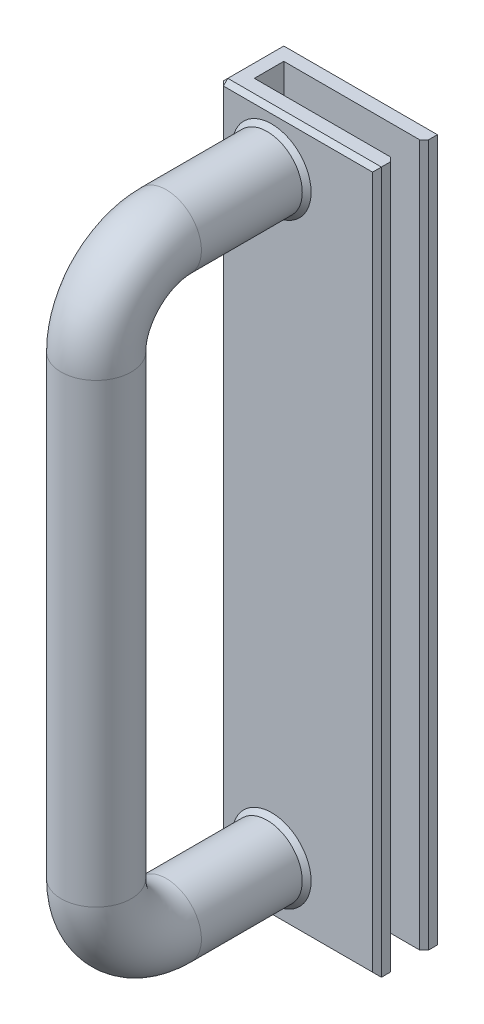
ISO-10303-21;
HEADER;
FILE_DESCRIPTION(('STEP AP214'),'2;1');
FILE_NAME('part.step','',(''),(''),'','','');
FILE_SCHEMA(('AUTOMOTIVE_DESIGN { 1 0 10303 214 1 1 1 1 }'));
ENDSEC;
DATA;
#1=APPLICATION_CONTEXT('core data for automotive mechanical design processes');
#2=APPLICATION_PROTOCOL_DEFINITION('international standard','automotive_design',2000,#1);
#3=PRODUCT_CONTEXT('',#1,'mechanical');
#4=PRODUCT('Part','Part','',(#3));
#5=PRODUCT_RELATED_PRODUCT_CATEGORY('part','',(#4));
#6=PRODUCT_DEFINITION_FORMATION('','',#4);
#7=PRODUCT_DEFINITION_CONTEXT('part definition',#1,'design');
#8=PRODUCT_DEFINITION('design','',#6,#7);
#9=PRODUCT_DEFINITION_SHAPE('','',#8);
#10=(LENGTH_UNIT() NAMED_UNIT(*) SI_UNIT(.MILLI.,.METRE.));
#11=(NAMED_UNIT(*) PLANE_ANGLE_UNIT() SI_UNIT($,.RADIAN.));
#12=(NAMED_UNIT(*) SI_UNIT($,.STERADIAN.) SOLID_ANGLE_UNIT());
#13=UNCERTAINTY_MEASURE_WITH_UNIT(LENGTH_MEASURE(1.E-05),#10,'distance_accuracy_value','');
#14=(GEOMETRIC_REPRESENTATION_CONTEXT(3) GLOBAL_UNCERTAINTY_ASSIGNED_CONTEXT((#13)) GLOBAL_UNIT_ASSIGNED_CONTEXT((#10,
#11,#12)) REPRESENTATION_CONTEXT('',''));
#15=CARTESIAN_POINT('',(0.,0.,0.));
#16=DIRECTION('',(0.,0.,1.));
#17=DIRECTION('',(1.,0.,0.));
#18=AXIS2_PLACEMENT_3D('',#15,#16,#17);
#19=CARTESIAN_POINT('',(12.7,127.,5.867));
#20=DIRECTION('',(0.,0.,-1.));
#21=DIRECTION('',(1.,0.,0.));
#22=AXIS2_PLACEMENT_3D('',#19,#20,#21);
#23=PLANE('',#22);
#24=DIRECTION('',(0.,-1.,0.));
#25=VECTOR('',#24,1.);
#26=CARTESIAN_POINT('',(11.9,127.,5.867));
#27=LINE('',#26,#25);
#28=CARTESIAN_POINT('',(11.9,126.2,5.867));
#29=VERTEX_POINT('',#28);
#30=CARTESIAN_POINT('',(11.9,0.799999999999967,5.867));
#31=VERTEX_POINT('',#30);
#32=EDGE_CURVE('E279',#29,#31,#27,.T.);
#33=ORIENTED_EDGE('',*,*,#32,.F.);
#34=DIRECTION('',(1.,0.,0.));
#35=VECTOR('',#34,1.);
#36=CARTESIAN_POINT('',(12.7,126.2,5.867));
#37=LINE('',#36,#35);
#38=CARTESIAN_POINT('',(-15.1,126.2,5.867));
#39=VERTEX_POINT('',#38);
#40=EDGE_CURVE('E282',#39,#29,#37,.T.);
#41=ORIENTED_EDGE('',*,*,#40,.F.);
#42=DIRECTION('',(0.,1.,0.));
#43=VECTOR('',#42,1.);
#44=CARTESIAN_POINT('',(-15.1,127.,5.867));
#45=LINE('',#44,#43);
#46=CARTESIAN_POINT('',(-15.1,0.799999999999967,5.867));
#47=VERTEX_POINT('',#46);
#48=EDGE_CURVE('E285',#47,#39,#45,.T.);
#49=ORIENTED_EDGE('',*,*,#48,.F.);
#50=DIRECTION('',(-1.,0.,0.));
#51=VECTOR('',#50,1.);
#52=CARTESIAN_POINT('',(12.7,0.799999999999967,5.867));
#53=LINE('',#52,#51);
#54=EDGE_CURVE('E287',#31,#47,#53,.T.);
#55=ORIENTED_EDGE('',*,*,#54,.F.);
#56=EDGE_LOOP('',(#33,#41,#49,#55));
#57=FACE_BOUND('',#56,.T.);
#58=CARTESIAN_POINT('',(-6.375,9.52500000000001,5.867));
#59=DIRECTION('',(0.,0.,1.));
#60=DIRECTION('',(1.,0.,0.));
#61=AXIS2_PLACEMENT_3D('',#58,#59,#60);
#62=CIRCLE('',#61,7.15);
#63=CARTESIAN_POINT('',(0.775000000000001,9.52500000000001,5.867));
#64=VERTEX_POINT('',#63);
#65=EDGE_CURVE('E276',#64,#64,#62,.T.);
#66=ORIENTED_EDGE('',*,*,#65,.F.);
#67=EDGE_LOOP('',(#66));
#68=FACE_BOUND('',#67,.T.);
#69=CARTESIAN_POINT('',(-6.375,117.475,5.867));
#70=DIRECTION('',(0.,0.,1.));
#71=DIRECTION('',(1.,0.,0.));
#72=AXIS2_PLACEMENT_3D('',#69,#70,#71);
#73=CIRCLE('',#72,7.15);
#74=CARTESIAN_POINT('',(0.775000000000001,117.475,5.867));
#75=VERTEX_POINT('',#74);
#76=EDGE_CURVE('E273',#75,#75,#73,.T.);
#77=ORIENTED_EDGE('',*,*,#76,.F.);
#78=EDGE_LOOP('',(#77));
#79=FACE_BOUND('',#78,.T.);
#80=ADVANCED_FACE('F40',(#57,#68,#79),#23,.F.);
#81=CARTESIAN_POINT('',(12.7,127.,-5.867));
#82=DIRECTION('',(-1.,0.,0.));
#83=DIRECTION('',(0.,0.,-1.));
#84=AXIS2_PLACEMENT_3D('',#81,#82,#83);
#85=PLANE('',#84);
#86=DIRECTION('',(0.,0.,1.));
#87=VECTOR('',#86,1.);
#88=CARTESIAN_POINT('',(12.7,0.,-5.867));
#89=LINE('',#88,#87);
#90=CARTESIAN_POINT('',(12.7,0.,-5.06700000000003));
#91=VERTEX_POINT('',#90);
#92=CARTESIAN_POINT('',(12.7,0.,-3.467));
#93=VERTEX_POINT('',#92);
#94=EDGE_CURVE('E195',#91,#93,#89,.T.);
#95=ORIENTED_EDGE('',*,*,#94,.F.);
#96=DIRECTION('',(0.,-1.,0.));
#97=VECTOR('',#96,1.);
#98=CARTESIAN_POINT('',(12.7,127.,-5.06700000000003));
#99=LINE('',#98,#97);
#100=CARTESIAN_POINT('',(12.7,127.,-5.06700000000003));
#101=VERTEX_POINT('',#100);
#102=EDGE_CURVE('E222',#101,#91,#99,.T.);
#103=ORIENTED_EDGE('',*,*,#102,.F.);
#104=DIRECTION('',(0.,0.,1.));
#105=VECTOR('',#104,1.);
#106=CARTESIAN_POINT('',(12.7,127.,-5.867));
#107=LINE('',#106,#105);
#108=CARTESIAN_POINT('',(12.7,127.,-3.467));
#109=VERTEX_POINT('',#108);
#110=EDGE_CURVE('E184',#101,#109,#107,.T.);
#111=ORIENTED_EDGE('',*,*,#110,.T.);
#112=DIRECTION('',(0.,1.,0.));
#113=VECTOR('',#112,1.);
#114=CARTESIAN_POINT('',(12.7,127.,-3.467));
#115=LINE('',#114,#113);
#116=EDGE_CURVE('E225',#93,#109,#115,.T.);
#117=ORIENTED_EDGE('',*,*,#116,.F.);
#118=EDGE_LOOP('',(#95,#103,#111,#117));
#119=FACE_BOUND('',#118,.T.);
#120=ADVANCED_FACE('F358',(#119),#85,.F.);
#121=CARTESIAN_POINT('',(12.7,127.,-2.667));
#122=DIRECTION('',(0.,0.,-1.));
#123=DIRECTION('',(1.,0.,0.));
#124=AXIS2_PLACEMENT_3D('',#121,#122,#123);
#125=PLANE('',#124);
#126=DIRECTION('',(-1.,0.,0.));
#127=VECTOR('',#126,1.);
#128=CARTESIAN_POINT('',(12.7,127.,-2.667));
#129=LINE('',#128,#127);
#130=CARTESIAN_POINT('',(11.9,127.,-2.667));
#131=VERTEX_POINT('',#130);
#132=CARTESIAN_POINT('',(-12.7,127.,-2.667));
#133=VERTEX_POINT('',#132);
#134=EDGE_CURVE('E163',#131,#133,#129,.T.);
#135=ORIENTED_EDGE('',*,*,#134,.T.);
#136=DIRECTION('',(0.,-1.,0.));
#137=VECTOR('',#136,1.);
#138=CARTESIAN_POINT('',(-12.7,127.,-2.667));
#139=LINE('',#138,#137);
#140=CARTESIAN_POINT('',(-12.7,0.,-2.667));
#141=VERTEX_POINT('',#140);
#142=EDGE_CURVE('E171',#133,#141,#139,.T.);
#143=ORIENTED_EDGE('',*,*,#142,.T.);
#144=DIRECTION('',(-1.,0.,0.));
#145=VECTOR('',#144,1.);
#146=CARTESIAN_POINT('',(12.7,0.,-2.667));
#147=LINE('',#146,#145);
#148=CARTESIAN_POINT('',(11.9,0.,-2.667));
#149=VERTEX_POINT('',#148);
#150=EDGE_CURVE('E198',#149,#141,#147,.T.);
#151=ORIENTED_EDGE('',*,*,#150,.F.);
#152=DIRECTION('',(0.,-1.,0.));
#153=VECTOR('',#152,1.);
#154=CARTESIAN_POINT('',(11.9,127.,-2.667));
#155=LINE('',#154,#153);
#156=EDGE_CURVE('E178',#131,#149,#155,.T.);
#157=ORIENTED_EDGE('',*,*,#156,.F.);
#158=EDGE_LOOP('',(#135,#143,#151,#157));
#159=FACE_BOUND('',#158,.T.);
#160=ADVANCED_FACE('F182',(#159),#125,.F.);
#161=CARTESIAN_POINT('',(-12.7,127.,-2.667));
#162=DIRECTION('',(-1.,0.,0.));
#163=DIRECTION('',(0.,0.,-1.));
#164=AXIS2_PLACEMENT_3D('',#161,#162,#163);
#165=PLANE('',#164);
#166=DIRECTION('',(0.,0.,1.));
#167=VECTOR('',#166,1.);
#168=CARTESIAN_POINT('',(-12.7,0.,-2.667));
#169=LINE('',#168,#167);
#170=CARTESIAN_POINT('',(-12.7,0.,2.667));
#171=VERTEX_POINT('',#170);
#172=EDGE_CURVE('E174',#141,#171,#169,.T.);
#173=ORIENTED_EDGE('',*,*,#172,.F.);
#174=ORIENTED_EDGE('',*,*,#142,.F.);
#175=DIRECTION('',(0.,0.,1.));
#176=VECTOR('',#175,1.);
#177=CARTESIAN_POINT('',(-12.7,127.,-2.667));
#178=LINE('',#177,#176);
#179=CARTESIAN_POINT('',(-12.7,127.,2.667));
#180=VERTEX_POINT('',#179);
#181=EDGE_CURVE('E158',#133,#180,#178,.T.);
#182=ORIENTED_EDGE('',*,*,#181,.T.);
#183=DIRECTION('',(0.,-1.,0.));
#184=VECTOR('',#183,1.);
#185=CARTESIAN_POINT('',(-12.7,127.,2.667));
#186=LINE('',#185,#184);
#187=EDGE_CURVE('E179',#180,#171,#186,.T.);
#188=ORIENTED_EDGE('',*,*,#187,.T.);
#189=EDGE_LOOP('',(#173,#174,#182,#188));
#190=FACE_BOUND('',#189,.T.);
#191=ADVANCED_FACE('F172',(#190),#165,.F.);
#192=CARTESIAN_POINT('',(-12.7,127.,2.667));
#193=DIRECTION('',(0.,0.,1.));
#194=DIRECTION('',(-1.,0.,0.));
#195=AXIS2_PLACEMENT_3D('',#192,#193,#194);
#196=PLANE('',#195);
#197=DIRECTION('',(1.,0.,0.));
#198=VECTOR('',#197,1.);
#199=CARTESIAN_POINT('',(-12.7,0.,2.667));
#200=LINE('',#199,#198);
#201=CARTESIAN_POINT('',(11.9,0.,2.667));
#202=VERTEX_POINT('',#201);
#203=EDGE_CURVE('E202',#171,#202,#200,.T.);
#204=ORIENTED_EDGE('',*,*,#203,.F.);
#205=ORIENTED_EDGE('',*,*,#187,.F.);
#206=DIRECTION('',(1.,0.,0.));
#207=VECTOR('',#206,1.);
#208=CARTESIAN_POINT('',(-12.7,127.,2.667));
#209=LINE('',#208,#207);
#210=CARTESIAN_POINT('',(11.9,127.,2.667));
#211=VERTEX_POINT('',#210);
#212=EDGE_CURVE('E165',#180,#211,#209,.T.);
#213=ORIENTED_EDGE('',*,*,#212,.T.);
#214=DIRECTION('',(0.,1.,0.));
#215=VECTOR('',#214,1.);
#216=CARTESIAN_POINT('',(11.9,127.,2.667));
#217=LINE('',#216,#215);
#218=EDGE_CURVE('E247',#202,#211,#217,.T.);
#219=ORIENTED_EDGE('',*,*,#218,.F.);
#220=EDGE_LOOP('',(#204,#205,#213,#219));
#221=FACE_BOUND('',#220,.T.);
#222=ADVANCED_FACE('F375',(#221),#196,.F.);
#223=CARTESIAN_POINT('',(12.7,127.,2.667));
#224=DIRECTION('',(-1.,0.,0.));
#225=DIRECTION('',(0.,0.,-1.));
#226=AXIS2_PLACEMENT_3D('',#223,#224,#225);
#227=PLANE('',#226);
#228=DIRECTION('',(0.,0.,1.));
#229=VECTOR('',#228,1.);
#230=CARTESIAN_POINT('',(12.7,127.,2.667));
#231=LINE('',#230,#229);
#232=CARTESIAN_POINT('',(12.7,127.,3.46700000000001));
#233=VERTEX_POINT('',#232);
#234=CARTESIAN_POINT('',(12.7,127.,5.06700000000001));
#235=VERTEX_POINT('',#234);
#236=EDGE_CURVE('E192',#233,#235,#231,.T.);
#237=ORIENTED_EDGE('',*,*,#236,.T.);
#238=DIRECTION('',(0.,1.,0.));
#239=VECTOR('',#238,1.);
#240=CARTESIAN_POINT('',(12.7,127.,5.06700000000001));
#241=LINE('',#240,#239);
#242=CARTESIAN_POINT('',(12.7,0.,5.06700000000001));
#243=VERTEX_POINT('',#242);
#244=EDGE_CURVE('E241',#243,#235,#241,.T.);
#245=ORIENTED_EDGE('',*,*,#244,.F.);
#246=DIRECTION('',(0.,0.,1.));
#247=VECTOR('',#246,1.);
#248=CARTESIAN_POINT('',(12.7,0.,2.667));
#249=LINE('',#248,#247);
#250=CARTESIAN_POINT('',(12.7,0.,3.46700000000001));
#251=VERTEX_POINT('',#250);
#252=EDGE_CURVE('E187',#251,#243,#249,.T.);
#253=ORIENTED_EDGE('',*,*,#252,.F.);
#254=DIRECTION('',(0.,-1.,0.));
#255=VECTOR('',#254,1.);
#256=CARTESIAN_POINT('',(12.7,127.,3.46700000000001));
#257=LINE('',#256,#255);
#258=EDGE_CURVE('E244',#233,#251,#257,.T.);
#259=ORIENTED_EDGE('',*,*,#258,.F.);
#260=EDGE_LOOP('',(#237,#245,#253,#259));
#261=FACE_BOUND('',#260,.T.);
#262=ADVANCED_FACE('F372',(#261),#227,.F.);
#263=CARTESIAN_POINT('',(-15.9,127.,5.867));
#264=DIRECTION('',(1.,0.,0.));
#265=DIRECTION('',(0.,0.,1.));
#266=AXIS2_PLACEMENT_3D('',#263,#264,#265);
#267=PLANE('',#266);
#268=DIRECTION('',(0.,-1.,0.));
#269=VECTOR('',#268,1.);
#270=CARTESIAN_POINT('',(-15.9,127.,5.06700000000001));
#271=LINE('',#270,#269);
#272=CARTESIAN_POINT('',(-15.9,126.2,5.06700000000001));
#273=VERTEX_POINT('',#272);
#274=CARTESIAN_POINT('',(-15.9,0.799999999999967,5.06700000000001));
#275=VERTEX_POINT('',#274);
#276=EDGE_CURVE('E265',#273,#275,#271,.T.);
#277=ORIENTED_EDGE('',*,*,#276,.F.);
#278=DIRECTION('',(0.,0.,1.));
#279=VECTOR('',#278,1.);
#280=CARTESIAN_POINT('',(-15.9,126.2,5.867));
#281=LINE('',#280,#279);
#282=CARTESIAN_POINT('',(-15.9,126.2,-5.06700000000001));
#283=VERTEX_POINT('',#282);
#284=EDGE_CURVE('E262',#283,#273,#281,.T.);
#285=ORIENTED_EDGE('',*,*,#284,.F.);
#286=DIRECTION('',(0.,1.,0.));
#287=VECTOR('',#286,1.);
#288=CARTESIAN_POINT('',(-15.9,127.,-5.06700000000001));
#289=LINE('',#288,#287);
#290=CARTESIAN_POINT('',(-15.9,0.799999999999967,-5.06700000000001));
#291=VERTEX_POINT('',#290);
#292=EDGE_CURVE('E267',#291,#283,#289,.T.);
#293=ORIENTED_EDGE('',*,*,#292,.F.);
#294=DIRECTION('',(0.,0.,-1.));
#295=VECTOR('',#294,1.);
#296=CARTESIAN_POINT('',(-15.9,0.799999999999967,5.867));
#297=LINE('',#296,#295);
#298=EDGE_CURVE('E270',#275,#291,#297,.T.);
#299=ORIENTED_EDGE('',*,*,#298,.F.);
#300=EDGE_LOOP('',(#277,#285,#293,#299));
#301=FACE_BOUND('',#300,.T.);
#302=ADVANCED_FACE('F370',(#301),#267,.F.);
#303=CARTESIAN_POINT('',(-15.9,127.,-5.867));
#304=DIRECTION('',(0.,0.,1.));
#305=DIRECTION('',(-1.,0.,0.));
#306=AXIS2_PLACEMENT_3D('',#303,#304,#305);
#307=PLANE('',#306);
#308=DIRECTION('',(0.,-1.,0.));
#309=VECTOR('',#308,1.);
#310=CARTESIAN_POINT('',(-15.1,127.,-5.867));
#311=LINE('',#310,#309);
#312=CARTESIAN_POINT('',(-15.1,126.2,-5.867));
#313=VERTEX_POINT('',#312);
#314=CARTESIAN_POINT('',(-15.1,0.799999999999967,-5.867));
#315=VERTEX_POINT('',#314);
#316=EDGE_CURVE('E256',#313,#315,#311,.T.);
#317=ORIENTED_EDGE('',*,*,#316,.F.);
#318=DIRECTION('',(-1.,0.,0.));
#319=VECTOR('',#318,1.);
#320=CARTESIAN_POINT('',(-15.9,126.2,-5.867));
#321=LINE('',#320,#319);
#322=CARTESIAN_POINT('',(11.9,126.2,-5.867));
#323=VERTEX_POINT('',#322);
#324=EDGE_CURVE('E250',#323,#313,#321,.T.);
#325=ORIENTED_EDGE('',*,*,#324,.F.);
#326=DIRECTION('',(0.,1.,0.));
#327=VECTOR('',#326,1.);
#328=CARTESIAN_POINT('',(11.9,127.,-5.867));
#329=LINE('',#328,#327);
#330=CARTESIAN_POINT('',(11.9,0.799999999999967,-5.867));
#331=VERTEX_POINT('',#330);
#332=EDGE_CURVE('E253',#331,#323,#329,.T.);
#333=ORIENTED_EDGE('',*,*,#332,.F.);
#334=DIRECTION('',(1.,0.,0.));
#335=VECTOR('',#334,1.);
#336=CARTESIAN_POINT('',(-15.9,0.799999999999967,-5.867));
#337=LINE('',#336,#335);
#338=EDGE_CURVE('E259',#315,#331,#337,.T.);
#339=ORIENTED_EDGE('',*,*,#338,.F.);
#340=EDGE_LOOP('',(#317,#325,#333,#339));
#341=FACE_BOUND('',#340,.T.);
#342=ADVANCED_FACE('F708',(#341),#307,.F.);
#343=CARTESIAN_POINT('',(0.,127.,0.));
#344=DIRECTION('',(0.,1.,0.));
#345=DIRECTION('',(0.,0.,1.));
#346=AXIS2_PLACEMENT_3D('',#343,#344,#345);
#347=PLANE('',#346);
#348=ORIENTED_EDGE('',*,*,#110,.F.);
#349=DIRECTION('',(1.,0.,0.));
#350=VECTOR('',#349,1.);
#351=CARTESIAN_POINT('',(12.7,127.,-5.06700000000003));
#352=LINE('',#351,#350);
#353=CARTESIAN_POINT('',(-15.1,127.,-5.06700000000004));
#354=VERTEX_POINT('',#353);
#355=EDGE_CURVE('E234',#354,#101,#352,.T.);
#356=ORIENTED_EDGE('',*,*,#355,.F.);
#357=DIRECTION('',(0.,0.,-1.));
#358=VECTOR('',#357,1.);
#359=CARTESIAN_POINT('',(-15.1,127.,-5.867));
#360=LINE('',#359,#358);
#361=CARTESIAN_POINT('',(-15.1,127.,5.06700000000001));
#362=VERTEX_POINT('',#361);
#363=EDGE_CURVE('E231',#362,#354,#360,.T.);
#364=ORIENTED_EDGE('',*,*,#363,.F.);
#365=DIRECTION('',(-1.,0.,0.));
#366=VECTOR('',#365,1.);
#367=CARTESIAN_POINT('',(-15.9,127.,5.06700000000001));
#368=LINE('',#367,#366);
#369=EDGE_CURVE('E228',#235,#362,#368,.T.);
#370=ORIENTED_EDGE('',*,*,#369,.F.);
#371=ORIENTED_EDGE('',*,*,#236,.F.);
#372=DIRECTION('',(-0.707106781186541,0.,-0.707106781186554));
#373=VECTOR('',#372,1.);
#374=CARTESIAN_POINT('',(4.61650000000012,127.,-4.61650000000003));
#375=LINE('',#374,#373);
#376=EDGE_CURVE('E237',#211,#233,#375,.F.);
#377=ORIENTED_EDGE('',*,*,#376,.F.);
#378=ORIENTED_EDGE('',*,*,#212,.F.);
#379=ORIENTED_EDGE('',*,*,#181,.F.);
#380=ORIENTED_EDGE('',*,*,#134,.F.);
#381=DIRECTION('',(0.707106781186535,0.,-0.70710678118656));
#382=VECTOR('',#381,1.);
#383=CARTESIAN_POINT('',(4.61650000000023,127.,4.61650000000007));
#384=LINE('',#383,#382);
#385=EDGE_CURVE('E239',#109,#131,#384,.F.);
#386=ORIENTED_EDGE('',*,*,#385,.F.);
#387=EDGE_LOOP('',(#348,#356,#364,#370,#371,#377,#378,#379,#380,#386));
#388=FACE_BOUND('',#387,.T.);
#389=ADVANCED_FACE('F161',(#388),#347,.T.);
#390=CARTESIAN_POINT('',(0.,0.,0.));
#391=DIRECTION('',(0.,1.,0.));
#392=DIRECTION('',(0.,0.,1.));
#393=AXIS2_PLACEMENT_3D('',#390,#391,#392);
#394=PLANE('',#393);
#395=ORIENTED_EDGE('',*,*,#150,.T.);
#396=ORIENTED_EDGE('',*,*,#172,.T.);
#397=ORIENTED_EDGE('',*,*,#203,.T.);
#398=DIRECTION('',(0.707106781186541,0.,0.707106781186554));
#399=VECTOR('',#398,1.);
#400=CARTESIAN_POINT('',(12.7,0.,3.46700000000001));
#401=LINE('',#400,#399);
#402=EDGE_CURVE('E218',#251,#202,#401,.F.);
#403=ORIENTED_EDGE('',*,*,#402,.F.);
#404=ORIENTED_EDGE('',*,*,#252,.T.);
#405=DIRECTION('',(1.,0.,0.));
#406=VECTOR('',#405,1.);
#407=CARTESIAN_POINT('',(0.,0.,5.06700000000001));
#408=LINE('',#407,#406);
#409=CARTESIAN_POINT('',(-15.1,0.,5.06700000000001));
#410=VERTEX_POINT('',#409);
#411=EDGE_CURVE('E209',#410,#243,#408,.T.);
#412=ORIENTED_EDGE('',*,*,#411,.F.);
#413=DIRECTION('',(0.,0.,1.));
#414=VECTOR('',#413,1.);
#415=CARTESIAN_POINT('',(-15.1,0.,0.));
#416=LINE('',#415,#414);
#417=CARTESIAN_POINT('',(-15.1,0.,-5.06700000000001));
#418=VERTEX_POINT('',#417);
#419=EDGE_CURVE('E212',#418,#410,#416,.T.);
#420=ORIENTED_EDGE('',*,*,#419,.F.);
#421=DIRECTION('',(-1.,0.,0.));
#422=VECTOR('',#421,1.);
#423=CARTESIAN_POINT('',(0.,0.,-5.06700000000001));
#424=LINE('',#423,#422);
#425=EDGE_CURVE('E215',#91,#418,#424,.T.);
#426=ORIENTED_EDGE('',*,*,#425,.F.);
#427=ORIENTED_EDGE('',*,*,#94,.T.);
#428=DIRECTION('',(-0.707106781186535,0.,0.70710678118656));
#429=VECTOR('',#428,1.);
#430=CARTESIAN_POINT('',(11.9,0.,-2.667));
#431=LINE('',#430,#429);
#432=EDGE_CURVE('E220',#149,#93,#431,.F.);
#433=ORIENTED_EDGE('',*,*,#432,.F.);
#434=EDGE_LOOP('',(#395,#396,#397,#403,#404,#412,#420,#426,#427,#433));
#435=FACE_BOUND('',#434,.T.);
#436=ADVANCED_FACE('F453',(#435),#394,.F.);
#437=CARTESIAN_POINT('',(-6.375,9.52500000000001,5.867));
#438=DIRECTION('',(0.,0.,1.));
#439=DIRECTION('',(-1.,0.,0.));
#440=AXIS2_PLACEMENT_3D('',#437,#438,#439);
#441=CYLINDRICAL_SURFACE('',#440,6.35);
#442=CARTESIAN_POINT('',(-6.375,9.52500000000001,6.66700000000001));
#443=DIRECTION('',(0.,0.,1.));
#444=DIRECTION('',(1.,0.,0.));
#445=AXIS2_PLACEMENT_3D('',#442,#443,#444);
#446=CIRCLE('',#445,6.35);
#447=CARTESIAN_POINT('',(-0.0250000000000025,9.52500000000001,6.66700000000001));
#448=VERTEX_POINT('',#447);
#449=EDGE_CURVE('E49',#448,#448,#446,.F.);
#450=ORIENTED_EDGE('',*,*,#449,.F.);
#451=EDGE_LOOP('',(#450));
#452=FACE_BOUND('',#451,.T.);
#453=CARTESIAN_POINT('',(-6.375,9.52500000000001,24.917));
#454=DIRECTION('',(0.,0.,-1.));
#455=DIRECTION('',(-1.,0.,0.));
#456=AXIS2_PLACEMENT_3D('',#453,#454,#455);
#457=CIRCLE('',#456,6.35);
#458=CARTESIAN_POINT('',(-6.375,3.175,24.917));
#459=VERTEX_POINT('',#458);
#460=EDGE_CURVE('E323',#459,#459,#457,.T.);
#461=ORIENTED_EDGE('',*,*,#460,.T.);
#462=EDGE_LOOP('',(#461));
#463=FACE_BOUND('',#462,.T.);
#464=ADVANCED_FACE('F450',(#452,#463),#441,.T.);
#465=CARTESIAN_POINT('',(-6.375,22.225,24.917));
#466=DIRECTION('',(1.,0.,0.));
#467=DIRECTION('',(0.,0.,1.));
#468=AXIS2_PLACEMENT_3D('',#465,#466,#467);
#469=TOROIDAL_SURFACE('',#468,12.7,6.35);
#470=CARTESIAN_POINT('',(-6.375,22.225,37.617));
#471=DIRECTION('',(0.,-1.,0.));
#472=DIRECTION('',(-1.,0.,0.));
#473=AXIS2_PLACEMENT_3D('',#470,#471,#472);
#474=CIRCLE('',#473,6.35);
#475=CARTESIAN_POINT('',(-6.375,22.225,43.967));
#476=VERTEX_POINT('',#475);
#477=EDGE_CURVE('E326',#476,#476,#474,.T.);
#478=CARTESIAN_POINT('',(-6.375,22.225,24.917));
#479=DIRECTION('',(1.,0.,0.));
#480=DIRECTION('',(0.,0.,1.));
#481=AXIS2_PLACEMENT_3D('',#478,#479,#480);
#482=CIRCLE('',#481,19.05);
#483=EDGE_CURVE('',#476,#459,#482,.T.);
#484=ORIENTED_EDGE('',*,*,#477,.T.);
#485=ORIENTED_EDGE('',*,*,#460,.F.);
#486=ORIENTED_EDGE('',*,*,#483,.T.);
#487=ORIENTED_EDGE('',*,*,#483,.F.);
#488=EDGE_LOOP('',(#484,#486,#485,#487));
#489=FACE_BOUND('',#488,.T.);
#490=ADVANCED_FACE('F452',(#489),#469,.T.);
#491=CARTESIAN_POINT('',(-6.375,22.225,37.617));
#492=DIRECTION('',(0.,1.,0.));
#493=DIRECTION('',(0.,0.,1.));
#494=AXIS2_PLACEMENT_3D('',#491,#492,#493);
#495=CYLINDRICAL_SURFACE('',#494,6.35);
#496=CARTESIAN_POINT('',(-6.375,104.775,37.617));
#497=DIRECTION('',(0.,-1.,0.));
#498=DIRECTION('',(-1.,0.,0.));
#499=AXIS2_PLACEMENT_3D('',#496,#497,#498);
#500=CIRCLE('',#499,6.35);
#501=CARTESIAN_POINT('',(-6.375,104.775,43.967));
#502=VERTEX_POINT('',#501);
#503=EDGE_CURVE('E331',#502,#502,#500,.T.);
#504=ORIENTED_EDGE('',*,*,#503,.T.);
#505=EDGE_LOOP('',(#504));
#506=FACE_BOUND('',#505,.T.);
#507=ORIENTED_EDGE('',*,*,#477,.F.);
#508=EDGE_LOOP('',(#507));
#509=FACE_BOUND('',#508,.T.);
#510=ADVANCED_FACE('F353',(#506,#509),#495,.T.);
#511=CARTESIAN_POINT('',(-6.375,104.775,24.917));
#512=DIRECTION('',(1.,0.,0.));
#513=DIRECTION('',(0.,0.,1.));
#514=AXIS2_PLACEMENT_3D('',#511,#512,#513);
#515=TOROIDAL_SURFACE('',#514,12.7,6.35);
#516=CARTESIAN_POINT('',(-6.375,117.475,24.917));
#517=DIRECTION('',(0.,0.,1.));
#518=DIRECTION('',(-1.,0.,0.));
#519=AXIS2_PLACEMENT_3D('',#516,#517,#518);
#520=CIRCLE('',#519,6.35);
#521=CARTESIAN_POINT('',(-6.375,123.825,24.917));
#522=VERTEX_POINT('',#521);
#523=EDGE_CURVE('E199',#522,#522,#520,.T.);
#524=CARTESIAN_POINT('',(-6.375,104.775,24.917));
#525=DIRECTION('',(1.,0.,0.));
#526=DIRECTION('',(0.,0.,1.));
#527=AXIS2_PLACEMENT_3D('',#524,#525,#526);
#528=CIRCLE('',#527,19.05);
#529=EDGE_CURVE('',#522,#502,#528,.T.);
#530=ORIENTED_EDGE('',*,*,#523,.T.);
#531=ORIENTED_EDGE('',*,*,#503,.F.);
#532=ORIENTED_EDGE('',*,*,#529,.T.);
#533=ORIENTED_EDGE('',*,*,#529,.F.);
#534=EDGE_LOOP('',(#530,#532,#531,#533));
#535=FACE_BOUND('',#534,.T.);
#536=ADVANCED_FACE('F338',(#535),#515,.T.);
#537=CARTESIAN_POINT('',(-6.375,117.475,24.917));
#538=DIRECTION('',(0.,0.,-1.));
#539=DIRECTION('',(1.,0.,0.));
#540=AXIS2_PLACEMENT_3D('',#537,#538,#539);
#541=CYLINDRICAL_SURFACE('',#540,6.35);
#542=CARTESIAN_POINT('',(-6.375,117.475,6.667));
#543=DIRECTION('',(0.,0.,1.));
#544=DIRECTION('',(1.,0.,0.));
#545=AXIS2_PLACEMENT_3D('',#542,#543,#544);
#546=CIRCLE('',#545,6.35);
#547=CARTESIAN_POINT('',(-0.0250000000000025,117.475,6.667));
#548=VERTEX_POINT('',#547);
#549=EDGE_CURVE('E11',#548,#548,#546,.F.);
#550=ORIENTED_EDGE('',*,*,#549,.F.);
#551=EDGE_LOOP('',(#550));
#552=FACE_BOUND('',#551,.T.);
#553=ORIENTED_EDGE('',*,*,#523,.F.);
#554=EDGE_LOOP('',(#553));
#555=FACE_BOUND('',#554,.T.);
#556=ADVANCED_FACE('F341',(#552,#555),#541,.T.);
#557=CARTESIAN_POINT('',(11.9,127.,-2.667));
#558=DIRECTION('',(-0.70710678118656,0.,-0.707106781186535));
#559=DIRECTION('',(0.,-1.,0.));
#560=AXIS2_PLACEMENT_3D('',#557,#558,#559);
#561=PLANE('',#560);
#562=ORIENTED_EDGE('',*,*,#385,.T.);
#563=ORIENTED_EDGE('',*,*,#156,.T.);
#564=ORIENTED_EDGE('',*,*,#432,.T.);
#565=ORIENTED_EDGE('',*,*,#116,.T.);
#566=EDGE_LOOP('',(#562,#563,#564,#565));
#567=FACE_BOUND('',#566,.T.);
#568=ADVANCED_FACE('F343',(#567),#561,.F.);
#569=CARTESIAN_POINT('',(12.7,127.,3.46700000000001));
#570=DIRECTION('',(-0.707106781186554,0.,0.707106781186541));
#571=DIRECTION('',(0.,-1.,0.));
#572=AXIS2_PLACEMENT_3D('',#569,#570,#571);
#573=PLANE('',#572);
#574=ORIENTED_EDGE('',*,*,#376,.T.);
#575=ORIENTED_EDGE('',*,*,#258,.T.);
#576=ORIENTED_EDGE('',*,*,#402,.T.);
#577=ORIENTED_EDGE('',*,*,#218,.T.);
#578=EDGE_LOOP('',(#574,#575,#576,#577));
#579=FACE_BOUND('',#578,.T.);
#580=ADVANCED_FACE('F350',(#579),#573,.F.);
#581=CARTESIAN_POINT('',(0.,127.,5.06700000000001));
#582=DIRECTION('',(0.,0.70710678118656,0.707106781186535));
#583=DIRECTION('',(1.,0.,0.));
#584=AXIS2_PLACEMENT_3D('',#581,#582,#583);
#585=PLANE('',#584);
#586=DIRECTION('',(0.,-0.707106781186535,0.70710678118656));
#587=VECTOR('',#586,1.);
#588=CARTESIAN_POINT('',(-15.1,126.2,5.867));
#589=LINE('',#588,#587);
#590=EDGE_CURVE('E321',#362,#39,#589,.T.);
#591=ORIENTED_EDGE('',*,*,#590,.T.);
#592=ORIENTED_EDGE('',*,*,#40,.T.);
#593=DIRECTION('',(-0.577350269189619,-0.577350269189619,0.577350269189639));
#594=VECTOR('',#593,1.);
#595=CARTESIAN_POINT('',(12.1666666666667,126.466666666667,5.60033333333334));
#596=LINE('',#595,#594);
#597=EDGE_CURVE('E44',#29,#235,#596,.F.);
#598=ORIENTED_EDGE('',*,*,#597,.T.);
#599=ORIENTED_EDGE('',*,*,#369,.T.);
#600=EDGE_LOOP('',(#591,#592,#598,#599));
#601=FACE_BOUND('',#600,.T.);
#602=ADVANCED_FACE('F386',(#601),#585,.T.);
#603=CARTESIAN_POINT('',(11.9,127.,5.867));
#604=DIRECTION('',(-0.70710678118656,0.,-0.707106781186535));
#605=DIRECTION('',(0.,-1.,0.));
#606=AXIS2_PLACEMENT_3D('',#603,#604,#605);
#607=PLANE('',#606);
#608=ORIENTED_EDGE('',*,*,#597,.F.);
#609=ORIENTED_EDGE('',*,*,#32,.T.);
#610=DIRECTION('',(-0.577350269189619,0.577350269189619,0.577350269189639));
#611=VECTOR('',#610,1.);
#612=CARTESIAN_POINT('',(-30.1666666666657,42.8666666666657,47.9336666666672));
#613=LINE('',#612,#611);
#614=EDGE_CURVE('E320',#31,#243,#613,.F.);
#615=ORIENTED_EDGE('',*,*,#614,.T.);
#616=ORIENTED_EDGE('',*,*,#244,.T.);
#617=EDGE_LOOP('',(#608,#609,#615,#616));
#618=FACE_BOUND('',#617,.T.);
#619=ADVANCED_FACE('F435',(#618),#607,.F.);
#620=CARTESIAN_POINT('',(-15.1,126.2,5.867));
#621=DIRECTION('',(-0.577350269189646,0.577350269189626,0.577350269189606));
#622=DIRECTION('',(0.707106781186535,0.70710678118656,0.));
#623=AXIS2_PLACEMENT_3D('',#620,#621,#622);
#624=PLANE('',#623);
#625=DIRECTION('',(0.707106781186535,0.70710678118656,0.));
#626=VECTOR('',#625,1.);
#627=CARTESIAN_POINT('',(-15.5,126.6,5.06700000000001));
#628=LINE('',#627,#626);
#629=EDGE_CURVE('E317',#362,#273,#628,.F.);
#630=ORIENTED_EDGE('',*,*,#629,.T.);
#631=DIRECTION('',(0.707106781186535,0.,0.70710678118656));
#632=VECTOR('',#631,1.);
#633=CARTESIAN_POINT('',(-15.1,126.2,5.867));
#634=LINE('',#633,#632);
#635=EDGE_CURVE('E65',#273,#39,#634,.T.);
#636=ORIENTED_EDGE('',*,*,#635,.T.);
#637=ORIENTED_EDGE('',*,*,#590,.F.);
#638=EDGE_LOOP('',(#630,#636,#637));
#639=FACE_BOUND('',#638,.T.);
#640=ADVANCED_FACE('F431',(#639),#624,.T.);
#641=CARTESIAN_POINT('',(12.7,0.799999999999967,5.867));
#642=DIRECTION('',(0.,0.70710678118656,-0.707106781186535));
#643=DIRECTION('',(-1.,0.,0.));
#644=AXIS2_PLACEMENT_3D('',#641,#642,#643);
#645=PLANE('',#644);
#646=ORIENTED_EDGE('',*,*,#614,.F.);
#647=ORIENTED_EDGE('',*,*,#54,.T.);
#648=DIRECTION('',(0.,0.707106781186535,0.70710678118656));
#649=VECTOR('',#648,1.);
#650=CARTESIAN_POINT('',(-15.1,0.,5.06700000000001));
#651=LINE('',#650,#649);
#652=EDGE_CURVE('E314',#47,#410,#651,.F.);
#653=ORIENTED_EDGE('',*,*,#652,.T.);
#654=ORIENTED_EDGE('',*,*,#411,.T.);
#655=EDGE_LOOP('',(#646,#647,#653,#654));
#656=FACE_BOUND('',#655,.T.);
#657=ADVANCED_FACE('F428',(#656),#645,.F.);
#658=CARTESIAN_POINT('',(-15.9,127.,5.06700000000001));
#659=DIRECTION('',(0.70710678118656,0.,-0.707106781186535));
#660=DIRECTION('',(0.,-1.,0.));
#661=AXIS2_PLACEMENT_3D('',#658,#659,#660);
#662=PLANE('',#661);
#663=ORIENTED_EDGE('',*,*,#635,.F.);
#664=ORIENTED_EDGE('',*,*,#276,.T.);
#665=DIRECTION('',(-0.707106781186535,0.,-0.70710678118656));
#666=VECTOR('',#665,1.);
#667=CARTESIAN_POINT('',(-15.5,0.799999999999968,5.46700000000001));
#668=LINE('',#667,#666);
#669=EDGE_CURVE('E57',#275,#47,#668,.F.);
#670=ORIENTED_EDGE('',*,*,#669,.T.);
#671=ORIENTED_EDGE('',*,*,#48,.T.);
#672=EDGE_LOOP('',(#663,#664,#670,#671));
#673=FACE_BOUND('',#672,.T.);
#674=ADVANCED_FACE('F424',(#673),#662,.F.);
#675=CARTESIAN_POINT('',(-15.1,127.,0.));
#676=DIRECTION('',(-0.70710678118656,0.707106781186535,0.));
#677=DIRECTION('',(0.,0.,1.));
#678=AXIS2_PLACEMENT_3D('',#675,#676,#677);
#679=PLANE('',#678);
#680=ORIENTED_EDGE('',*,*,#629,.F.);
#681=ORIENTED_EDGE('',*,*,#363,.T.);
#682=DIRECTION('',(-0.707106781186535,-0.70710678118656,0.));
#683=VECTOR('',#682,1.);
#684=CARTESIAN_POINT('',(-15.9,126.2,-5.06700000000001));
#685=LINE('',#684,#683);
#686=EDGE_CURVE('E310',#354,#283,#685,.T.);
#687=ORIENTED_EDGE('',*,*,#686,.T.);
#688=ORIENTED_EDGE('',*,*,#284,.T.);
#689=EDGE_LOOP('',(#680,#681,#687,#688));
#690=FACE_BOUND('',#689,.T.);
#691=ADVANCED_FACE('F420',(#690),#679,.T.);
#692=CARTESIAN_POINT('',(-15.1,0.,5.06700000000001));
#693=DIRECTION('',(-0.577350269189626,-0.577350269189646,0.577350269189606));
#694=DIRECTION('',(-0.70710678118656,0.707106781186535,0.));
#695=AXIS2_PLACEMENT_3D('',#692,#693,#694);
#696=PLANE('',#695);
#697=ORIENTED_EDGE('',*,*,#669,.F.);
#698=DIRECTION('',(0.70710678118656,-0.707106781186535,0.));
#699=VECTOR('',#698,1.);
#700=CARTESIAN_POINT('',(-15.1,0.,5.06700000000001));
#701=LINE('',#700,#699);
#702=EDGE_CURVE('E308',#275,#410,#701,.T.);
#703=ORIENTED_EDGE('',*,*,#702,.T.);
#704=ORIENTED_EDGE('',*,*,#652,.F.);
#705=EDGE_LOOP('',(#697,#703,#704));
#706=FACE_BOUND('',#705,.T.);
#707=ADVANCED_FACE('F416',(#706),#696,.T.);
#708=CARTESIAN_POINT('',(-15.9,126.2,-5.06700000000001));
#709=DIRECTION('',(-0.577350269189646,0.577350269189606,-0.577350269189626));
#710=DIRECTION('',(0.707106781186535,0.,-0.70710678118656));
#711=AXIS2_PLACEMENT_3D('',#708,#709,#710);
#712=PLANE('',#711);
#713=DIRECTION('',(0.,0.70710678118656,0.707106781186535));
#714=VECTOR('',#713,1.);
#715=CARTESIAN_POINT('',(-15.1,126.6,-5.46700000000002));
#716=LINE('',#715,#714);
#717=EDGE_CURVE('E303',#354,#313,#716,.F.);
#718=ORIENTED_EDGE('',*,*,#717,.T.);
#719=DIRECTION('',(-0.707106781186535,0.,0.70710678118656));
#720=VECTOR('',#719,1.);
#721=CARTESIAN_POINT('',(-15.9,126.2,-5.06700000000001));
#722=LINE('',#721,#720);
#723=EDGE_CURVE('E306',#313,#283,#722,.T.);
#724=ORIENTED_EDGE('',*,*,#723,.T.);
#725=ORIENTED_EDGE('',*,*,#686,.F.);
#726=EDGE_LOOP('',(#718,#724,#725));
#727=FACE_BOUND('',#726,.T.);
#728=ADVANCED_FACE('F412',(#727),#712,.T.);
#729=CARTESIAN_POINT('',(-15.9,0.799999999999967,5.867));
#730=DIRECTION('',(0.707106781186535,0.70710678118656,0.));
#731=DIRECTION('',(0.,0.,-1.));
#732=AXIS2_PLACEMENT_3D('',#729,#730,#731);
#733=PLANE('',#732);
#734=ORIENTED_EDGE('',*,*,#702,.F.);
#735=ORIENTED_EDGE('',*,*,#298,.T.);
#736=DIRECTION('',(-0.70710678118656,0.707106781186535,0.));
#737=VECTOR('',#736,1.);
#738=CARTESIAN_POINT('',(-15.1,0.,-5.06700000000001));
#739=LINE('',#738,#737);
#740=EDGE_CURVE('E300',#291,#418,#739,.F.);
#741=ORIENTED_EDGE('',*,*,#740,.T.);
#742=ORIENTED_EDGE('',*,*,#419,.T.);
#743=EDGE_LOOP('',(#734,#735,#741,#742));
#744=FACE_BOUND('',#743,.T.);
#745=ADVANCED_FACE('F408',(#744),#733,.F.);
#746=CARTESIAN_POINT('',(-15.1,127.,-5.867));
#747=DIRECTION('',(0.70710678118656,0.,0.707106781186535));
#748=DIRECTION('',(0.,-1.,0.));
#749=AXIS2_PLACEMENT_3D('',#746,#747,#748);
#750=PLANE('',#749);
#751=ORIENTED_EDGE('',*,*,#723,.F.);
#752=ORIENTED_EDGE('',*,*,#316,.T.);
#753=DIRECTION('',(0.707106781186535,0.,-0.70710678118656));
#754=VECTOR('',#753,1.);
#755=CARTESIAN_POINT('',(-15.5,0.799999999999968,-5.46700000000001));
#756=LINE('',#755,#754);
#757=EDGE_CURVE('E298',#315,#291,#756,.F.);
#758=ORIENTED_EDGE('',*,*,#757,.T.);
#759=ORIENTED_EDGE('',*,*,#292,.T.);
#760=EDGE_LOOP('',(#751,#752,#758,#759));
#761=FACE_BOUND('',#760,.T.);
#762=ADVANCED_FACE('F404',(#761),#750,.F.);
#763=CARTESIAN_POINT('',(0.,127.,-5.06700000000003));
#764=DIRECTION('',(0.,0.707106781186535,-0.70710678118656));
#765=DIRECTION('',(-1.,0.,0.));
#766=AXIS2_PLACEMENT_3D('',#763,#764,#765);
#767=PLANE('',#766);
#768=ORIENTED_EDGE('',*,*,#717,.F.);
#769=ORIENTED_EDGE('',*,*,#355,.T.);
#770=DIRECTION('',(-0.577350269189632,-0.577350269189633,-0.577350269189613));
#771=VECTOR('',#770,1.);
#772=CARTESIAN_POINT('',(8.46666666666659,122.766666666667,-9.30033333333332));
#773=LINE('',#772,#771);
#774=EDGE_CURVE('E296',#101,#323,#773,.T.);
#775=ORIENTED_EDGE('',*,*,#774,.T.);
#776=ORIENTED_EDGE('',*,*,#324,.T.);
#777=EDGE_LOOP('',(#768,#769,#775,#776));
#778=FACE_BOUND('',#777,.T.);
#779=ADVANCED_FACE('F400',(#778),#767,.T.);
#780=CARTESIAN_POINT('',(-15.1,0.,-5.06700000000001));
#781=DIRECTION('',(-0.577350269189626,-0.577350269189646,-0.577350269189606));
#782=DIRECTION('',(-0.70710678118656,0.707106781186535,0.));
#783=AXIS2_PLACEMENT_3D('',#780,#781,#782);
#784=PLANE('',#783);
#785=ORIENTED_EDGE('',*,*,#757,.F.);
#786=DIRECTION('',(0.,-0.707106781186535,0.70710678118656));
#787=VECTOR('',#786,1.);
#788=CARTESIAN_POINT('',(-15.1,0.,-5.06700000000001));
#789=LINE('',#788,#787);
#790=EDGE_CURVE('E294',#315,#418,#789,.T.);
#791=ORIENTED_EDGE('',*,*,#790,.T.);
#792=ORIENTED_EDGE('',*,*,#740,.F.);
#793=EDGE_LOOP('',(#785,#791,#792));
#794=FACE_BOUND('',#793,.T.);
#795=ADVANCED_FACE('F396',(#794),#784,.T.);
#796=CARTESIAN_POINT('',(12.7,127.,-5.06700000000003));
#797=DIRECTION('',(-0.707106781186536,0.,0.707106781186559));
#798=DIRECTION('',(0.,-1.,0.));
#799=AXIS2_PLACEMENT_3D('',#796,#797,#798);
#800=PLANE('',#799);
#801=ORIENTED_EDGE('',*,*,#774,.F.);
#802=ORIENTED_EDGE('',*,*,#102,.T.);
#803=DIRECTION('',(0.577350269189645,-0.577350269189606,0.577350269189626));
#804=VECTOR('',#803,1.);
#805=CARTESIAN_POINT('',(-29.6333333333333,42.3333333333305,-47.400333333332));
#806=LINE('',#805,#804);
#807=EDGE_CURVE('E292',#91,#331,#806,.F.);
#808=ORIENTED_EDGE('',*,*,#807,.T.);
#809=ORIENTED_EDGE('',*,*,#332,.T.);
#810=EDGE_LOOP('',(#801,#802,#808,#809));
#811=FACE_BOUND('',#810,.T.);
#812=ADVANCED_FACE('F392',(#811),#800,.F.);
#813=CARTESIAN_POINT('',(-15.9,0.799999999999967,-5.867));
#814=DIRECTION('',(0.,0.70710678118656,0.707106781186535));
#815=DIRECTION('',(1.,0.,0.));
#816=AXIS2_PLACEMENT_3D('',#813,#814,#815);
#817=PLANE('',#816);
#818=ORIENTED_EDGE('',*,*,#790,.F.);
#819=ORIENTED_EDGE('',*,*,#338,.T.);
#820=ORIENTED_EDGE('',*,*,#807,.F.);
#821=ORIENTED_EDGE('',*,*,#425,.T.);
#822=EDGE_LOOP('',(#818,#819,#820,#821));
#823=FACE_BOUND('',#822,.T.);
#824=ADVANCED_FACE('F388',(#823),#817,.F.);
#825=CARTESIAN_POINT('',(-6.375,9.52500000000001,6.66700000000001));
#826=DIRECTION('',(0.,0.,-1.));
#827=DIRECTION('',(1.,0.,0.));
#828=AXIS2_PLACEMENT_3D('',#825,#826,#827);
#829=CONICAL_SURFACE('',#828,6.35,0.785398163397445);
#830=ORIENTED_EDGE('',*,*,#65,.T.);
#831=EDGE_LOOP('',(#830));
#832=FACE_BOUND('',#831,.T.);
#833=ORIENTED_EDGE('',*,*,#449,.T.);
#834=EDGE_LOOP('',(#833));
#835=FACE_BOUND('',#834,.T.);
#836=ADVANCED_FACE('F391',(#832,#835),#829,.T.);
#837=CARTESIAN_POINT('',(-6.375,117.475,5.867));
#838=DIRECTION('',(0.,0.,-1.));
#839=DIRECTION('',(1.,0.,0.));
#840=AXIS2_PLACEMENT_3D('',#837,#838,#839);
#841=CONICAL_SURFACE('',#840,7.15,0.785398163397451);
#842=CARTESIAN_POINT('',(-0.0250000000000025,117.475,6.667));
#843=CARTESIAN_POINT('',(-0.0166666666666688,117.475,6.65866666666667));
#844=CARTESIAN_POINT('',(-0.00833333333333522,117.475,6.65033333333333));
#845=CARTESIAN_POINT('',(0.0083333333333316,117.475,6.63366666666667));
#846=CARTESIAN_POINT('',(0.0166666666666649,117.475,6.62533333333334));
#847=CARTESIAN_POINT('',(0.0333333333333314,117.475,6.60866666666667));
#848=CARTESIAN_POINT('',(0.0416666666666646,117.475,6.60033333333334));
#849=CARTESIAN_POINT('',(0.0583333333333315,117.475,6.58366666666667));
#850=CARTESIAN_POINT('',(0.0666666666666652,117.475,6.57533333333334));
#851=CARTESIAN_POINT('',(0.0833333333333321,117.475,6.55866666666667));
#852=CARTESIAN_POINT('',(0.0916666666666653,117.475,6.55033333333334));
#853=CARTESIAN_POINT('',(0.108333333333332,117.475,6.53366666666667));
#854=CARTESIAN_POINT('',(0.116666666666665,117.475,6.52533333333334));
#855=CARTESIAN_POINT('',(0.133333333333332,117.475,6.50866666666667));
#856=CARTESIAN_POINT('',(0.141666666666665,117.475,6.50033333333334));
#857=CARTESIAN_POINT('',(0.158333333333332,117.475,6.48366666666667));
#858=CARTESIAN_POINT('',(0.166666666666665,117.475,6.47533333333334));
#859=CARTESIAN_POINT('',(0.183333333333332,117.475,6.45866666666667));
#860=CARTESIAN_POINT('',(0.191666666666666,117.475,6.45033333333334));
#861=CARTESIAN_POINT('',(0.208333333333332,117.475,6.43366666666667));
#862=CARTESIAN_POINT('',(0.216666666666665,117.475,6.42533333333334));
#863=CARTESIAN_POINT('',(0.233333333333332,117.475,6.40866666666667));
#864=CARTESIAN_POINT('',(0.241666666666665,117.475,6.40033333333334));
#865=CARTESIAN_POINT('',(0.258333333333332,117.475,6.38366666666667));
#866=CARTESIAN_POINT('',(0.266666666666666,117.475,6.37533333333334));
#867=CARTESIAN_POINT('',(0.283333333333333,117.475,6.35866666666667));
#868=CARTESIAN_POINT('',(0.291666666666666,117.475,6.35033333333334));
#869=CARTESIAN_POINT('',(0.308333333333332,117.475,6.33366666666667));
#870=CARTESIAN_POINT('',(0.316666666666665,117.475,6.32533333333334));
#871=CARTESIAN_POINT('',(0.333333333333332,117.475,6.30866666666667));
#872=CARTESIAN_POINT('',(0.341666666666666,117.475,6.30033333333334));
#873=CARTESIAN_POINT('',(0.358333333333333,117.475,6.28366666666667));
#874=CARTESIAN_POINT('',(0.366666666666666,117.475,6.27533333333334));
#875=CARTESIAN_POINT('',(0.383333333333333,117.475,6.25866666666667));
#876=CARTESIAN_POINT('',(0.391666666666666,117.475,6.25033333333334));
#877=CARTESIAN_POINT('',(0.408333333333333,117.475,6.23366666666667));
#878=CARTESIAN_POINT('',(0.416666666666667,117.475,6.22533333333334));
#879=CARTESIAN_POINT('',(0.433333333333333,117.475,6.20866666666667));
#880=CARTESIAN_POINT('',(0.441666666666667,117.475,6.20033333333334));
#881=CARTESIAN_POINT('',(0.458333333333333,117.475,6.18366666666667));
#882=CARTESIAN_POINT('',(0.466666666666666,117.475,6.17533333333334));
#883=CARTESIAN_POINT('',(0.483333333333333,117.475,6.15866666666667));
#884=CARTESIAN_POINT('',(0.491666666666666,117.475,6.15033333333334));
#885=CARTESIAN_POINT('',(0.508333333333333,117.475,6.13366666666667));
#886=CARTESIAN_POINT('',(0.516666666666667,117.475,6.12533333333334));
#887=CARTESIAN_POINT('',(0.533333333333334,117.475,6.10866666666667));
#888=CARTESIAN_POINT('',(0.541666666666667,117.475,6.10033333333334));
#889=CARTESIAN_POINT('',(0.558333333333333,117.475,6.08366666666667));
#890=CARTESIAN_POINT('',(0.566666666666667,117.475,6.07533333333334));
#891=CARTESIAN_POINT('',(0.583333333333333,117.475,6.05866666666667));
#892=CARTESIAN_POINT('',(0.591666666666666,117.475,6.05033333333334));
#893=CARTESIAN_POINT('',(0.608333333333333,117.475,6.03366666666667));
#894=CARTESIAN_POINT('',(0.616666666666667,117.475,6.02533333333334));
#895=CARTESIAN_POINT('',(0.633333333333334,117.475,6.00866666666667));
#896=CARTESIAN_POINT('',(0.641666666666667,117.475,6.00033333333334));
#897=CARTESIAN_POINT('',(0.658333333333334,117.475,5.98366666666667));
#898=CARTESIAN_POINT('',(0.666666666666667,117.475,5.97533333333334));
#899=CARTESIAN_POINT('',(0.683333333333334,117.475,5.95866666666667));
#900=CARTESIAN_POINT('',(0.691666666666667,117.475,5.95033333333334));
#901=CARTESIAN_POINT('',(0.708333333333334,117.475,5.93366666666667));
#902=CARTESIAN_POINT('',(0.716666666666668,117.475,5.92533333333334));
#903=CARTESIAN_POINT('',(0.733333333333334,117.475,5.90866666666667));
#904=CARTESIAN_POINT('',(0.741666666666667,117.475,5.90033333333334));
#905=CARTESIAN_POINT('',(0.758333333333334,117.475,5.88366666666667));
#906=CARTESIAN_POINT('',(0.766666666666668,117.475,5.87533333333334));
#907=CARTESIAN_POINT('',(0.775000000000001,117.475,5.867));
#908=B_SPLINE_CURVE_WITH_KNOTS('',3,(#842,#843,#844,#845,#846,#847,#848,#849,#850,#851,#852,
#853,#854,#855,#856,#857,#858,#859,#860,#861,#862,#863,#864,#865,#866,#867,#868,#869,#870,#871,
#872,#873,#874,#875,#876,#877,#878,#879,#880,#881,#882,#883,#884,#885,#886,#887,#888,#889,#890,
#891,#892,#893,#894,#895,#896,#897,#898,#899,#900,#901,#902,#903,#904,#905,#906,#907),
.UNSPECIFIED.,.F.,.F.,(4,2,2,2,2,2,2,2,2,2,2,2,2,2,2,2,2,2,2,2,2,2,2,2,2,2,2,2,2,2,2,2,4),(0.,
0.0353553390593278,0.0707106781186549,0.106066017177982,0.14142135623731,0.176776695296637,
0.212132034355964,0.247487373415291,0.28284271247462,0.318198051533947,0.353553390593274,
0.388908729652601,0.424264068711929,0.459619407771256,0.494974746830583,0.530330085889911,
0.565685424949239,0.601040764008566,0.636396103067894,0.671751442127221,0.707106781186548,
0.742462120245875,0.777817459305203,0.81317279836453,0.848528137423858,0.883883476483185,
0.919238815542513,0.95459415460184,0.989949493661167,1.0253048327205,1.06066017177982,
1.09601551083915,1.13137084989848),.UNSPECIFIED.);
#909=EDGE_CURVE('BSEAM42',#548,#75,#908,.T.);
#910=ORIENTED_EDGE('',*,*,#549,.T.);
#911=ORIENTED_EDGE('',*,*,#76,.T.);
#912=ORIENTED_EDGE('',*,*,#909,.T.);
#913=ORIENTED_EDGE('',*,*,#909,.F.);
#914=EDGE_LOOP('',(#910,#912,#911,#913));
#915=FACE_BOUND('',#914,.T.);
#916=ADVANCED_FACE('F42',(#915),#841,.T.);
#917=CLOSED_SHELL('',(#80,#120,#160,#191,#222,#262,#302,#342,#389,#436,#464,#490,#510,#536,#556,
#568,#580,#602,#619,#640,#657,#674,#691,#707,#728,#745,#762,#779,#795,#812,#824,#836,#916));
#918=MANIFOLD_SOLID_BREP('B2',#917);
#919=ADVANCED_BREP_SHAPE_REPRESENTATION('',(#18,#918),#14);
#920=SHAPE_DEFINITION_REPRESENTATION(#9,#919);
ENDSEC;
END-ISO-10303-21;
